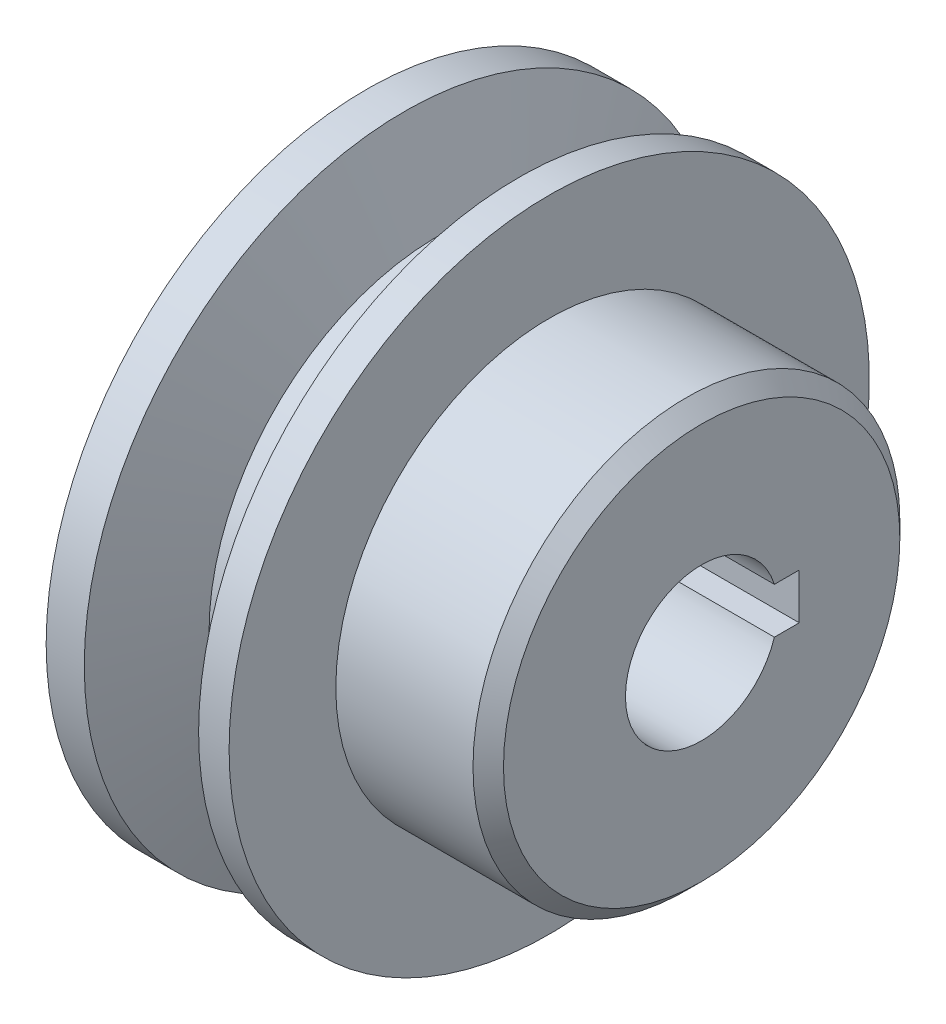
ISO-10303-21;
HEADER;
FILE_DESCRIPTION(('STEP AP214'),'2;1');
FILE_NAME('part.step','',(''),(''),'','','');
FILE_SCHEMA(('AUTOMOTIVE_DESIGN { 1 0 10303 214 1 1 1 1 }'));
ENDSEC;
DATA;
#1=APPLICATION_CONTEXT('core data for automotive mechanical design processes');
#2=APPLICATION_PROTOCOL_DEFINITION('international standard','automotive_design',2000,#1);
#3=PRODUCT_CONTEXT('',#1,'mechanical');
#4=PRODUCT('Part','Part','',(#3));
#5=PRODUCT_RELATED_PRODUCT_CATEGORY('part','',(#4));
#6=PRODUCT_DEFINITION_FORMATION('','',#4);
#7=PRODUCT_DEFINITION_CONTEXT('part definition',#1,'design');
#8=PRODUCT_DEFINITION('design','',#6,#7);
#9=PRODUCT_DEFINITION_SHAPE('','',#8);
#10=(LENGTH_UNIT() NAMED_UNIT(*) SI_UNIT(.MILLI.,.METRE.));
#11=(NAMED_UNIT(*) PLANE_ANGLE_UNIT() SI_UNIT($,.RADIAN.));
#12=(NAMED_UNIT(*) SI_UNIT($,.STERADIAN.) SOLID_ANGLE_UNIT());
#13=UNCERTAINTY_MEASURE_WITH_UNIT(LENGTH_MEASURE(1.E-05),#10,'distance_accuracy_value','');
#14=(GEOMETRIC_REPRESENTATION_CONTEXT(3) GLOBAL_UNCERTAINTY_ASSIGNED_CONTEXT((#13)) GLOBAL_UNIT_ASSIGNED_CONTEXT((#10,
#11,#12)) REPRESENTATION_CONTEXT('',''));
#15=CARTESIAN_POINT('',(0.,0.,0.));
#16=DIRECTION('',(0.,0.,1.));
#17=DIRECTION('',(1.,0.,0.));
#18=AXIS2_PLACEMENT_3D('',#15,#16,#17);
#19=CARTESIAN_POINT('',(-12.,21.,0.));
#20=DIRECTION('',(1.,0.,0.));
#21=DIRECTION('',(0.,0.,-1.));
#22=AXIS2_PLACEMENT_3D('',#19,#20,#21);
#23=PLANE('',#22);
#24=CARTESIAN_POINT('',(-12.,0.,0.));
#25=DIRECTION('',(-1.,0.,0.));
#26=DIRECTION('',(0.,0.,1.));
#27=AXIS2_PLACEMENT_3D('',#24,#25,#26);
#28=CIRCLE('',#27,5.);
#29=CARTESIAN_POINT('',(-12.,-1.5,-4.76969600708473));
#30=VERTEX_POINT('',#29);
#31=CARTESIAN_POINT('',(-12.,1.5,-4.76969600708473));
#32=VERTEX_POINT('',#31);
#33=EDGE_CURVE('E158',#30,#32,#28,.T.);
#34=ORIENTED_EDGE('',*,*,#33,.F.);
#35=DIRECTION('',(0.,0.,1.));
#36=VECTOR('',#35,1.);
#37=CARTESIAN_POINT('',(-12.,-1.5,-4.76969600708473));
#38=LINE('',#37,#36);
#39=CARTESIAN_POINT('',(-12.,-1.5,-6.4));
#40=VERTEX_POINT('',#39);
#41=EDGE_CURVE('E107',#40,#30,#38,.T.);
#42=ORIENTED_EDGE('',*,*,#41,.F.);
#43=DIRECTION('',(0.,-1.,0.));
#44=VECTOR('',#43,1.);
#45=CARTESIAN_POINT('',(-12.,1.5,-6.4));
#46=LINE('',#45,#44);
#47=CARTESIAN_POINT('',(-12.,1.5,-6.4));
#48=VERTEX_POINT('',#47);
#49=EDGE_CURVE('E88',#48,#40,#46,.T.);
#50=ORIENTED_EDGE('',*,*,#49,.F.);
#51=DIRECTION('',(0.,0.,-1.));
#52=VECTOR('',#51,1.);
#53=CARTESIAN_POINT('',(-12.,1.5,-4.76969600708473));
#54=LINE('',#53,#52);
#55=EDGE_CURVE('E97',#32,#48,#54,.T.);
#56=ORIENTED_EDGE('',*,*,#55,.F.);
#57=EDGE_LOOP('',(#34,#42,#50,#56));
#58=FACE_BOUND('',#57,.T.);
#59=CARTESIAN_POINT('',(-12.,0.,0.));
#60=DIRECTION('',(-1.,0.,0.));
#61=DIRECTION('',(0.,0.,1.));
#62=AXIS2_PLACEMENT_3D('',#59,#60,#61);
#63=CIRCLE('',#62,21.);
#64=CARTESIAN_POINT('',(-12.,0.,21.));
#65=VERTEX_POINT('',#64);
#66=EDGE_CURVE('E104',#65,#65,#63,.T.);
#67=ORIENTED_EDGE('',*,*,#66,.T.);
#68=EDGE_LOOP('',(#67));
#69=FACE_BOUND('',#68,.T.);
#70=ADVANCED_FACE('F44',(#58,#69),#23,.F.);
#71=CARTESIAN_POINT('',(-92.4779379024817,0.,0.));
#72=DIRECTION('',(-1.,0.,0.));
#73=DIRECTION('',(0.,0.,1.));
#74=AXIS2_PLACEMENT_3D('',#71,#72,#73);
#75=CYLINDRICAL_SURFACE('',#74,5.);
#76=CARTESIAN_POINT('',(9.99999999999999,0.,0.));
#77=DIRECTION('',(-1.,0.,0.));
#78=DIRECTION('',(0.,0.,1.));
#79=AXIS2_PLACEMENT_3D('',#76,#77,#78);
#80=CIRCLE('',#79,5.);
#81=CARTESIAN_POINT('',(9.99999999999999,-1.5,-4.76969600708473));
#82=VERTEX_POINT('',#81);
#83=CARTESIAN_POINT('',(9.99999999999999,1.5,-4.76969600708473));
#84=VERTEX_POINT('',#83);
#85=EDGE_CURVE('E154',#82,#84,#80,.T.);
#86=ORIENTED_EDGE('',*,*,#85,.F.);
#87=DIRECTION('',(1.,0.,0.));
#88=VECTOR('',#87,1.);
#89=CARTESIAN_POINT('',(-12.001,-1.5,-4.76969600708473));
#90=LINE('',#89,#88);
#91=EDGE_CURVE('E122',#30,#82,#90,.T.);
#92=ORIENTED_EDGE('',*,*,#91,.F.);
#93=ORIENTED_EDGE('',*,*,#33,.T.);
#94=DIRECTION('',(1.,0.,0.));
#95=VECTOR('',#94,1.);
#96=CARTESIAN_POINT('',(-12.001,1.5,-4.76969600708473));
#97=LINE('',#96,#95);
#98=EDGE_CURVE('E93',#32,#84,#97,.T.);
#99=ORIENTED_EDGE('',*,*,#98,.T.);
#100=EDGE_LOOP('',(#86,#92,#93,#99));
#101=FACE_BOUND('',#100,.T.);
#102=ADVANCED_FACE('F181',(#101),#75,.F.);
#103=CARTESIAN_POINT('',(9.99999999999999,5.,0.));
#104=DIRECTION('',(-1.,0.,0.));
#105=DIRECTION('',(0.,0.,1.));
#106=AXIS2_PLACEMENT_3D('',#103,#104,#105);
#107=PLANE('',#106);
#108=CARTESIAN_POINT('',(9.99999999999999,0.,0.));
#109=DIRECTION('',(-1.,0.,0.));
#110=DIRECTION('',(0.,0.,1.));
#111=AXIS2_PLACEMENT_3D('',#108,#109,#110);
#112=CIRCLE('',#111,13.);
#113=CARTESIAN_POINT('',(9.99999999999999,0.,13.));
#114=VERTEX_POINT('',#113);
#115=EDGE_CURVE('E11',#114,#114,#112,.F.);
#116=ORIENTED_EDGE('',*,*,#115,.T.);
#117=EDGE_LOOP('',(#116));
#118=FACE_BOUND('',#117,.T.);
#119=DIRECTION('',(0.,1.,0.));
#120=VECTOR('',#119,1.);
#121=CARTESIAN_POINT('',(9.99999999999999,1.5,-6.4));
#122=LINE('',#121,#120);
#123=CARTESIAN_POINT('',(9.99999999999999,-1.5,-6.4));
#124=VERTEX_POINT('',#123);
#125=CARTESIAN_POINT('',(9.99999999999999,1.5,-6.4));
#126=VERTEX_POINT('',#125);
#127=EDGE_CURVE('E61',#124,#126,#122,.T.);
#128=ORIENTED_EDGE('',*,*,#127,.F.);
#129=DIRECTION('',(0.,0.,-1.));
#130=VECTOR('',#129,1.);
#131=CARTESIAN_POINT('',(9.99999999999999,-1.5,-4.76969600708473));
#132=LINE('',#131,#130);
#133=EDGE_CURVE('E94',#82,#124,#132,.T.);
#134=ORIENTED_EDGE('',*,*,#133,.F.);
#135=ORIENTED_EDGE('',*,*,#85,.T.);
#136=DIRECTION('',(0.,0.,1.));
#137=VECTOR('',#136,1.);
#138=CARTESIAN_POINT('',(9.99999999999999,1.5,-4.76969600708473));
#139=LINE('',#138,#137);
#140=EDGE_CURVE('E115',#126,#84,#139,.T.);
#141=ORIENTED_EDGE('',*,*,#140,.F.);
#142=EDGE_LOOP('',(#128,#134,#135,#141));
#143=FACE_BOUND('',#142,.T.);
#144=ADVANCED_FACE('F185',(#118,#143),#107,.F.);
#145=CARTESIAN_POINT('',(-92.4779379024817,0.,0.));
#146=DIRECTION('',(-1.,0.,0.));
#147=DIRECTION('',(0.,0.,1.));
#148=AXIS2_PLACEMENT_3D('',#145,#146,#147);
#149=CYLINDRICAL_SURFACE('',#148,14.);
#150=CARTESIAN_POINT('',(8.99999999999999,0.,0.));
#151=DIRECTION('',(-1.,0.,0.));
#152=DIRECTION('',(0.,0.,1.));
#153=AXIS2_PLACEMENT_3D('',#150,#151,#152);
#154=CIRCLE('',#153,14.);
#155=CARTESIAN_POINT('',(8.99999999999999,0.,14.));
#156=VERTEX_POINT('',#155);
#157=EDGE_CURVE('E54',#156,#156,#154,.T.);
#158=ORIENTED_EDGE('',*,*,#157,.T.);
#159=EDGE_LOOP('',(#158));
#160=FACE_BOUND('',#159,.T.);
#161=CARTESIAN_POINT('',(0.,0.,0.));
#162=DIRECTION('',(-1.,0.,0.));
#163=DIRECTION('',(0.,0.,1.));
#164=AXIS2_PLACEMENT_3D('',#161,#162,#163);
#165=CIRCLE('',#164,14.);
#166=CARTESIAN_POINT('',(0.,0.,14.));
#167=VERTEX_POINT('',#166);
#168=EDGE_CURVE('E150',#167,#167,#165,.T.);
#169=ORIENTED_EDGE('',*,*,#168,.F.);
#170=EDGE_LOOP('',(#169));
#171=FACE_BOUND('',#170,.T.);
#172=ADVANCED_FACE('F164',(#160,#171),#149,.T.);
#173=CARTESIAN_POINT('',(0.,14.,0.));
#174=DIRECTION('',(-1.,0.,0.));
#175=DIRECTION('',(0.,0.,1.));
#176=AXIS2_PLACEMENT_3D('',#173,#174,#175);
#177=PLANE('',#176);
#178=CARTESIAN_POINT('',(0.,0.,0.));
#179=DIRECTION('',(-1.,0.,0.));
#180=DIRECTION('',(0.,0.,1.));
#181=AXIS2_PLACEMENT_3D('',#178,#179,#180);
#182=CIRCLE('',#181,21.);
#183=CARTESIAN_POINT('',(0.,0.,21.));
#184=VERTEX_POINT('',#183);
#185=EDGE_CURVE('E146',#184,#184,#182,.T.);
#186=ORIENTED_EDGE('',*,*,#185,.F.);
#187=EDGE_LOOP('',(#186));
#188=FACE_BOUND('',#187,.T.);
#189=ORIENTED_EDGE('',*,*,#168,.T.);
#190=EDGE_LOOP('',(#189));
#191=FACE_BOUND('',#190,.T.);
#192=ADVANCED_FACE('F194',(#188,#191),#177,.F.);
#193=CARTESIAN_POINT('',(-92.4779379024817,0.,0.));
#194=DIRECTION('',(-1.,0.,0.));
#195=DIRECTION('',(0.,0.,1.));
#196=AXIS2_PLACEMENT_3D('',#193,#194,#195);
#197=CYLINDRICAL_SURFACE('',#196,21.);
#198=CARTESIAN_POINT('',(-2.,0.,0.));
#199=DIRECTION('',(-1.,0.,0.));
#200=DIRECTION('',(0.,0.,1.));
#201=AXIS2_PLACEMENT_3D('',#198,#199,#200);
#202=CIRCLE('',#201,21.);
#203=CARTESIAN_POINT('',(-2.,0.,21.));
#204=VERTEX_POINT('',#203);
#205=EDGE_CURVE('E142',#204,#204,#202,.T.);
#206=ORIENTED_EDGE('',*,*,#205,.F.);
#207=EDGE_LOOP('',(#206));
#208=FACE_BOUND('',#207,.T.);
#209=ORIENTED_EDGE('',*,*,#185,.T.);
#210=EDGE_LOOP('',(#209));
#211=FACE_BOUND('',#210,.T.);
#212=ADVANCED_FACE('F197',(#208,#211),#197,.T.);
#213=CARTESIAN_POINT('',(-2.,0.,0.));
#214=DIRECTION('',(1.,0.,0.));
#215=DIRECTION('',(0.,0.,-1.));
#216=AXIS2_PLACEMENT_3D('',#213,#214,#215);
#217=CONICAL_SURFACE('',#216,21.,1.22173047639603);
#218=CARTESIAN_POINT('',(-4.18382140559723,0.,0.));
#219=DIRECTION('',(-1.,0.,0.));
#220=DIRECTION('',(0.,0.,1.));
#221=AXIS2_PLACEMENT_3D('',#218,#219,#220);
#222=CIRCLE('',#221,15.);
#223=CARTESIAN_POINT('',(-4.18382140559723,0.,15.));
#224=VERTEX_POINT('',#223);
#225=EDGE_CURVE('E138',#224,#224,#222,.T.);
#226=ORIENTED_EDGE('',*,*,#225,.F.);
#227=EDGE_LOOP('',(#226));
#228=FACE_BOUND('',#227,.T.);
#229=ORIENTED_EDGE('',*,*,#205,.T.);
#230=EDGE_LOOP('',(#229));
#231=FACE_BOUND('',#230,.T.);
#232=ADVANCED_FACE('F201',(#228,#231),#217,.T.);
#233=CARTESIAN_POINT('',(-92.4779379024817,0.,0.));
#234=DIRECTION('',(-1.,0.,0.));
#235=DIRECTION('',(0.,0.,1.));
#236=AXIS2_PLACEMENT_3D('',#233,#234,#235);
#237=CYLINDRICAL_SURFACE('',#236,15.);
#238=CARTESIAN_POINT('',(-7.31617859440283,0.,0.));
#239=DIRECTION('',(-1.,0.,0.));
#240=DIRECTION('',(0.,0.,1.));
#241=AXIS2_PLACEMENT_3D('',#238,#239,#240);
#242=CIRCLE('',#241,15.);
#243=CARTESIAN_POINT('',(-7.31617859440283,0.,15.));
#244=VERTEX_POINT('',#243);
#245=EDGE_CURVE('E134',#244,#244,#242,.T.);
#246=ORIENTED_EDGE('',*,*,#245,.F.);
#247=EDGE_LOOP('',(#246));
#248=FACE_BOUND('',#247,.T.);
#249=ORIENTED_EDGE('',*,*,#225,.T.);
#250=EDGE_LOOP('',(#249));
#251=FACE_BOUND('',#250,.T.);
#252=ADVANCED_FACE('F205',(#248,#251),#237,.T.);
#253=CARTESIAN_POINT('',(-7.31617859440283,0.,0.));
#254=DIRECTION('',(-1.,0.,0.));
#255=DIRECTION('',(0.,0.,1.));
#256=AXIS2_PLACEMENT_3D('',#253,#254,#255);
#257=CONICAL_SURFACE('',#256,15.,1.22173047639604);
#258=CARTESIAN_POINT('',(-9.49999999999999,0.,0.));
#259=DIRECTION('',(-1.,0.,0.));
#260=DIRECTION('',(0.,0.,1.));
#261=AXIS2_PLACEMENT_3D('',#258,#259,#260);
#262=CIRCLE('',#261,21.);
#263=CARTESIAN_POINT('',(-9.49999999999999,0.,21.));
#264=VERTEX_POINT('',#263);
#265=EDGE_CURVE('E130',#264,#264,#262,.T.);
#266=ORIENTED_EDGE('',*,*,#265,.F.);
#267=EDGE_LOOP('',(#266));
#268=FACE_BOUND('',#267,.T.);
#269=ORIENTED_EDGE('',*,*,#245,.T.);
#270=EDGE_LOOP('',(#269));
#271=FACE_BOUND('',#270,.T.);
#272=ADVANCED_FACE('F176',(#268,#271),#257,.T.);
#273=CARTESIAN_POINT('',(-92.4779379024817,0.,0.));
#274=DIRECTION('',(-1.,0.,0.));
#275=DIRECTION('',(0.,0.,1.));
#276=AXIS2_PLACEMENT_3D('',#273,#274,#275);
#277=CYLINDRICAL_SURFACE('',#276,21.);
#278=ORIENTED_EDGE('',*,*,#66,.F.);
#279=EDGE_LOOP('',(#278));
#280=FACE_BOUND('',#279,.T.);
#281=ORIENTED_EDGE('',*,*,#265,.T.);
#282=EDGE_LOOP('',(#281));
#283=FACE_BOUND('',#282,.T.);
#284=ADVANCED_FACE('F168',(#280,#283),#277,.T.);
#285=CARTESIAN_POINT('',(8.99999999999999,0.,0.));
#286=DIRECTION('',(-1.,0.,0.));
#287=DIRECTION('',(0.,0.,1.));
#288=AXIS2_PLACEMENT_3D('',#285,#286,#287);
#289=CONICAL_SURFACE('',#288,14.,0.785398163397449);
#290=ORIENTED_EDGE('',*,*,#115,.F.);
#291=EDGE_LOOP('',(#290));
#292=FACE_BOUND('',#291,.T.);
#293=ORIENTED_EDGE('',*,*,#157,.F.);
#294=EDGE_LOOP('',(#293));
#295=FACE_BOUND('',#294,.T.);
#296=ADVANCED_FACE('F47',(#292,#295),#289,.T.);
#297=CARTESIAN_POINT('',(-12.001,1.5,-6.4));
#298=DIRECTION('',(0.,0.,-1.));
#299=DIRECTION('',(-1.,0.,0.));
#300=AXIS2_PLACEMENT_3D('',#297,#298,#299);
#301=PLANE('',#300);
#302=ORIENTED_EDGE('',*,*,#49,.T.);
#303=DIRECTION('',(1.,0.,0.));
#304=VECTOR('',#303,1.);
#305=CARTESIAN_POINT('',(-12.001,-1.5,-6.4));
#306=LINE('',#305,#304);
#307=EDGE_CURVE('E68',#40,#124,#306,.T.);
#308=ORIENTED_EDGE('',*,*,#307,.T.);
#309=ORIENTED_EDGE('',*,*,#127,.T.);
#310=DIRECTION('',(1.,0.,0.));
#311=VECTOR('',#310,1.);
#312=CARTESIAN_POINT('',(-12.001,1.5,-6.4));
#313=LINE('',#312,#311);
#314=EDGE_CURVE('E84',#48,#126,#313,.T.);
#315=ORIENTED_EDGE('',*,*,#314,.F.);
#316=EDGE_LOOP('',(#302,#308,#309,#315));
#317=FACE_BOUND('',#316,.T.);
#318=ADVANCED_FACE('F86',(#317),#301,.F.);
#319=CARTESIAN_POINT('',(-12.001,-1.5,-4.76969600708473));
#320=DIRECTION('',(0.,-1.,0.));
#321=DIRECTION('',(0.,0.,-1.));
#322=AXIS2_PLACEMENT_3D('',#319,#320,#321);
#323=PLANE('',#322);
#324=ORIENTED_EDGE('',*,*,#41,.T.);
#325=ORIENTED_EDGE('',*,*,#91,.T.);
#326=ORIENTED_EDGE('',*,*,#133,.T.);
#327=ORIENTED_EDGE('',*,*,#307,.F.);
#328=EDGE_LOOP('',(#324,#325,#326,#327));
#329=FACE_BOUND('',#328,.T.);
#330=ADVANCED_FACE('F174',(#329),#323,.F.);
#331=CARTESIAN_POINT('',(-12.001,1.5,-4.76969600708473));
#332=DIRECTION('',(0.,1.,0.));
#333=DIRECTION('',(0.,0.,1.));
#334=AXIS2_PLACEMENT_3D('',#331,#332,#333);
#335=PLANE('',#334);
#336=ORIENTED_EDGE('',*,*,#55,.T.);
#337=ORIENTED_EDGE('',*,*,#314,.T.);
#338=ORIENTED_EDGE('',*,*,#140,.T.);
#339=ORIENTED_EDGE('',*,*,#98,.F.);
#340=EDGE_LOOP('',(#336,#337,#338,#339));
#341=FACE_BOUND('',#340,.T.);
#342=ADVANCED_FACE('F98',(#341),#335,.F.);
#343=CLOSED_SHELL('',(#70,#102,#144,#172,#192,#212,#232,#252,#272,#284,#296,#318,#330,#342));
#344=MANIFOLD_SOLID_BREP('B2',#343);
#345=ADVANCED_BREP_SHAPE_REPRESENTATION('',(#18,#344),#14);
#346=SHAPE_DEFINITION_REPRESENTATION(#9,#345);
ENDSEC;
END-ISO-10303-21;
